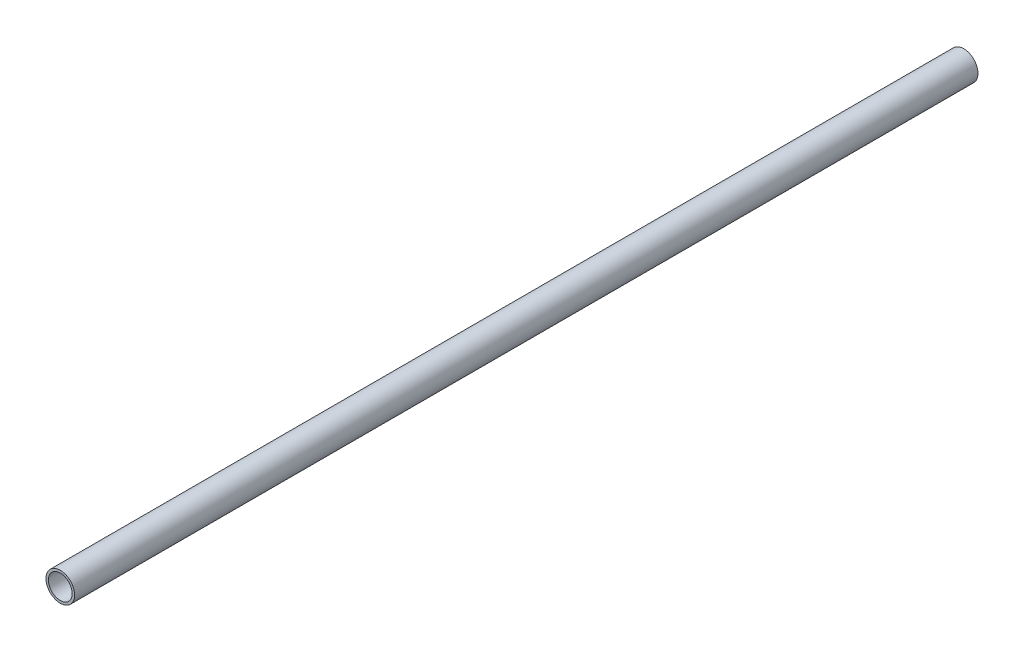
ISO-10303-21;
HEADER;
FILE_DESCRIPTION(('STEP AP214'),'2;1');
FILE_NAME('part.step','',(''),(''),'','','');
FILE_SCHEMA(('AUTOMOTIVE_DESIGN { 1 0 10303 214 1 1 1 1 }'));
ENDSEC;
DATA;
#1=APPLICATION_CONTEXT('core data for automotive mechanical design processes');
#2=APPLICATION_PROTOCOL_DEFINITION('international standard','automotive_design',2000,#1);
#3=PRODUCT_CONTEXT('',#1,'mechanical');
#4=PRODUCT('Part','Part','',(#3));
#5=PRODUCT_RELATED_PRODUCT_CATEGORY('part','',(#4));
#6=PRODUCT_DEFINITION_FORMATION('','',#4);
#7=PRODUCT_DEFINITION_CONTEXT('part definition',#1,'design');
#8=PRODUCT_DEFINITION('design','',#6,#7);
#9=PRODUCT_DEFINITION_SHAPE('','',#8);
#10=(LENGTH_UNIT() NAMED_UNIT(*) SI_UNIT(.MILLI.,.METRE.));
#11=(NAMED_UNIT(*) PLANE_ANGLE_UNIT() SI_UNIT($,.RADIAN.));
#12=(NAMED_UNIT(*) SI_UNIT($,.STERADIAN.) SOLID_ANGLE_UNIT());
#13=UNCERTAINTY_MEASURE_WITH_UNIT(LENGTH_MEASURE(1.E-05),#10,'distance_accuracy_value','');
#14=(GEOMETRIC_REPRESENTATION_CONTEXT(3) GLOBAL_UNCERTAINTY_ASSIGNED_CONTEXT((#13)) GLOBAL_UNIT_ASSIGNED_CONTEXT((#10,
#11,#12)) REPRESENTATION_CONTEXT('',''));
#15=CARTESIAN_POINT('',(0.,0.,0.));
#16=DIRECTION('',(0.,0.,1.));
#17=DIRECTION('',(1.,0.,0.));
#18=AXIS2_PLACEMENT_3D('',#15,#16,#17);
#19=CARTESIAN_POINT('',(0.,3.95,0.));
#20=DIRECTION('',(0.,0.,-1.));
#21=DIRECTION('',(-1.,0.,0.));
#22=AXIS2_PLACEMENT_3D('',#19,#20,#21);
#23=PLANE('',#22);
#24=CARTESIAN_POINT('',(0.,0.,0.));
#25=DIRECTION('',(0.,0.,1.));
#26=DIRECTION('',(1.,0.,0.));
#27=AXIS2_PLACEMENT_3D('',#24,#25,#26);
#28=CIRCLE('',#27,3.95);
#29=CARTESIAN_POINT('',(3.95,0.,0.));
#30=VERTEX_POINT('',#29);
#31=EDGE_CURVE('E53',#30,#30,#28,.T.);
#32=ORIENTED_EDGE('',*,*,#31,.F.);
#33=EDGE_LOOP('',(#32));
#34=FACE_BOUND('',#33,.T.);
#35=CARTESIAN_POINT('',(0.,0.,0.));
#36=DIRECTION('',(0.,0.,1.));
#37=DIRECTION('',(1.,0.,0.));
#38=AXIS2_PLACEMENT_3D('',#35,#36,#37);
#39=CIRCLE('',#38,4.75);
#40=CARTESIAN_POINT('',(4.75,0.,0.));
#41=VERTEX_POINT('',#40);
#42=EDGE_CURVE('E10',#41,#41,#39,.T.);
#43=ORIENTED_EDGE('',*,*,#42,.T.);
#44=EDGE_LOOP('',(#43));
#45=FACE_BOUND('',#44,.T.);
#46=ADVANCED_FACE('F39',(#34,#45),#23,.F.);
#47=CARTESIAN_POINT('',(0.,0.,0.));
#48=DIRECTION('',(0.,0.,1.));
#49=DIRECTION('',(1.,0.,0.));
#50=AXIS2_PLACEMENT_3D('',#47,#48,#49);
#51=CYLINDRICAL_SURFACE('',#50,4.75);
#52=ORIENTED_EDGE('',*,*,#42,.F.);
#53=EDGE_LOOP('',(#52));
#54=FACE_BOUND('',#53,.T.);
#55=CARTESIAN_POINT('',(0.,0.,-300.));
#56=DIRECTION('',(0.,0.,1.));
#57=DIRECTION('',(1.,0.,0.));
#58=AXIS2_PLACEMENT_3D('',#55,#56,#57);
#59=CIRCLE('',#58,4.75);
#60=CARTESIAN_POINT('',(4.75,0.,-300.));
#61=VERTEX_POINT('',#60);
#62=EDGE_CURVE('E45',#61,#61,#59,.T.);
#63=ORIENTED_EDGE('',*,*,#62,.T.);
#64=EDGE_LOOP('',(#63));
#65=FACE_BOUND('',#64,.T.);
#66=ADVANCED_FACE('F62',(#54,#65),#51,.T.);
#67=CARTESIAN_POINT('',(0.,3.95,-300.));
#68=DIRECTION('',(0.,0.,1.));
#69=DIRECTION('',(1.,0.,0.));
#70=AXIS2_PLACEMENT_3D('',#67,#68,#69);
#71=PLANE('',#70);
#72=ORIENTED_EDGE('',*,*,#62,.F.);
#73=EDGE_LOOP('',(#72));
#74=FACE_BOUND('',#73,.T.);
#75=CARTESIAN_POINT('',(0.,0.,-300.));
#76=DIRECTION('',(0.,0.,1.));
#77=DIRECTION('',(1.,0.,0.));
#78=AXIS2_PLACEMENT_3D('',#75,#76,#77);
#79=CIRCLE('',#78,3.95);
#80=CARTESIAN_POINT('',(3.95,0.,-300.));
#81=VERTEX_POINT('',#80);
#82=EDGE_CURVE('E49',#81,#81,#79,.T.);
#83=ORIENTED_EDGE('',*,*,#82,.T.);
#84=EDGE_LOOP('',(#83));
#85=FACE_BOUND('',#84,.T.);
#86=ADVANCED_FACE('F66',(#74,#85),#71,.F.);
#87=CARTESIAN_POINT('',(0.,0.,0.));
#88=DIRECTION('',(0.,0.,1.));
#89=DIRECTION('',(1.,0.,0.));
#90=AXIS2_PLACEMENT_3D('',#87,#88,#89);
#91=CYLINDRICAL_SURFACE('',#90,3.95);
#92=ORIENTED_EDGE('',*,*,#82,.F.);
#93=EDGE_LOOP('',(#92));
#94=FACE_BOUND('',#93,.T.);
#95=ORIENTED_EDGE('',*,*,#31,.T.);
#96=EDGE_LOOP('',(#95));
#97=FACE_BOUND('',#96,.T.);
#98=ADVANCED_FACE('F59',(#94,#97),#91,.F.);
#99=CLOSED_SHELL('',(#46,#66,#86,#98));
#100=MANIFOLD_SOLID_BREP('B2',#99);
#101=ADVANCED_BREP_SHAPE_REPRESENTATION('',(#18,#100),#14);
#102=SHAPE_DEFINITION_REPRESENTATION(#9,#101);
ENDSEC;
END-ISO-10303-21;
